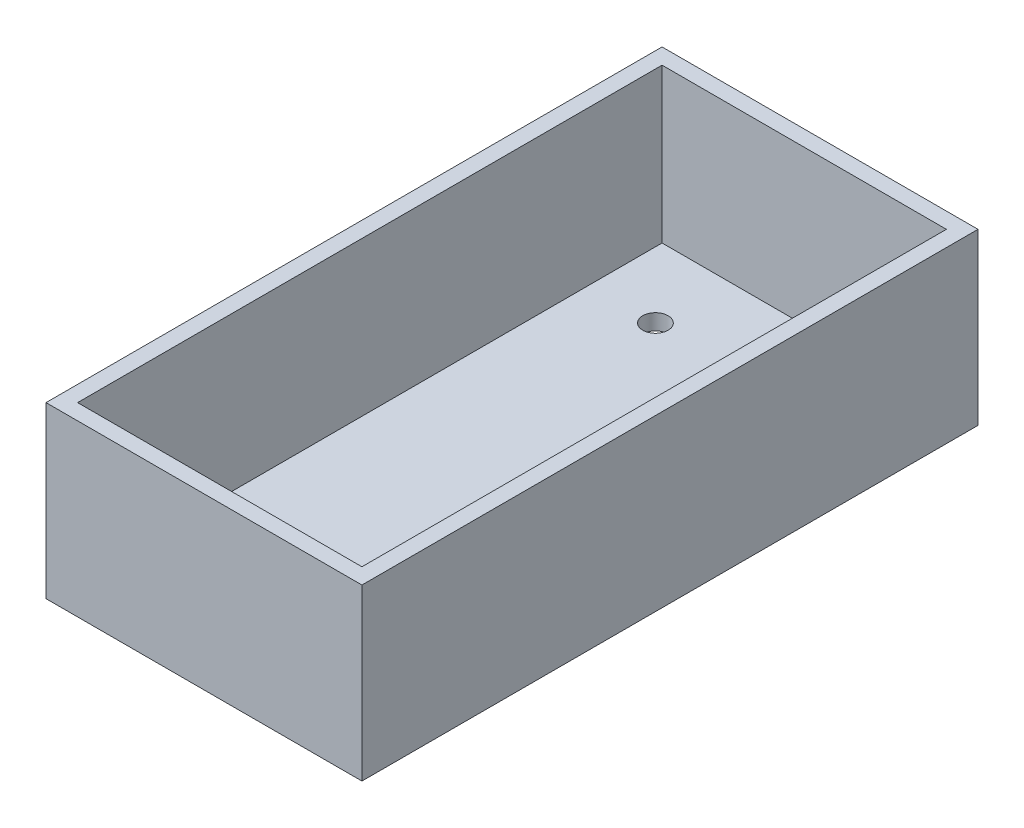
ISO-10303-21;
HEADER;
FILE_DESCRIPTION(('STEP AP214'),'2;1');
FILE_NAME('part.step','',(''),(''),'','','');
FILE_SCHEMA(('AUTOMOTIVE_DESIGN { 1 0 10303 214 1 1 1 1 }'));
ENDSEC;
DATA;
#1=APPLICATION_CONTEXT('core data for automotive mechanical design processes');
#2=APPLICATION_PROTOCOL_DEFINITION('international standard','automotive_design',2000,#1);
#3=PRODUCT_CONTEXT('',#1,'mechanical');
#4=PRODUCT('Part','Part','',(#3));
#5=PRODUCT_RELATED_PRODUCT_CATEGORY('part','',(#4));
#6=PRODUCT_DEFINITION_FORMATION('','',#4);
#7=PRODUCT_DEFINITION_CONTEXT('part definition',#1,'design');
#8=PRODUCT_DEFINITION('design','',#6,#7);
#9=PRODUCT_DEFINITION_SHAPE('','',#8);
#10=(LENGTH_UNIT() NAMED_UNIT(*) SI_UNIT(.MILLI.,.METRE.));
#11=(NAMED_UNIT(*) PLANE_ANGLE_UNIT() SI_UNIT($,.RADIAN.));
#12=(NAMED_UNIT(*) SI_UNIT($,.STERADIAN.) SOLID_ANGLE_UNIT());
#13=UNCERTAINTY_MEASURE_WITH_UNIT(LENGTH_MEASURE(1.E-05),#10,'distance_accuracy_value','');
#14=(GEOMETRIC_REPRESENTATION_CONTEXT(3) GLOBAL_UNCERTAINTY_ASSIGNED_CONTEXT((#13)) GLOBAL_UNIT_ASSIGNED_CONTEXT((#10,
#11,#12)) REPRESENTATION_CONTEXT('',''));
#15=CARTESIAN_POINT('',(0.,0.,0.));
#16=DIRECTION('',(0.,0.,1.));
#17=DIRECTION('',(1.,0.,0.));
#18=AXIS2_PLACEMENT_3D('',#15,#16,#17);
#19=CARTESIAN_POINT('',(0.,21.5,0.));
#20=DIRECTION('',(0.,-1.,0.));
#21=DIRECTION('',(0.,0.,-1.));
#22=AXIS2_PLACEMENT_3D('',#19,#20,#21);
#23=PLANE('',#22);
#24=DIRECTION('',(1.,0.,0.));
#25=VECTOR('',#24,1.);
#26=CARTESIAN_POINT('',(40.,21.5,0.));
#27=LINE('',#26,#25);
#28=CARTESIAN_POINT('',(0.,21.5,0.));
#29=VERTEX_POINT('',#28);
#30=CARTESIAN_POINT('',(40.,21.5,0.));
#31=VERTEX_POINT('',#30);
#32=EDGE_CURVE('E142',#29,#31,#27,.T.);
#33=ORIENTED_EDGE('',*,*,#32,.T.);
#34=DIRECTION('',(0.,0.,-1.));
#35=VECTOR('',#34,1.);
#36=CARTESIAN_POINT('',(40.,21.5,-78.));
#37=LINE('',#36,#35);
#38=CARTESIAN_POINT('',(40.,21.5,-78.));
#39=VERTEX_POINT('',#38);
#40=EDGE_CURVE('E86',#31,#39,#37,.T.);
#41=ORIENTED_EDGE('',*,*,#40,.T.);
#42=DIRECTION('',(-1.,0.,0.));
#43=VECTOR('',#42,1.);
#44=CARTESIAN_POINT('',(0.,21.5,-78.));
#45=LINE('',#44,#43);
#46=CARTESIAN_POINT('',(0.,21.5,-78.));
#47=VERTEX_POINT('',#46);
#48=EDGE_CURVE('E145',#39,#47,#45,.T.);
#49=ORIENTED_EDGE('',*,*,#48,.T.);
#50=DIRECTION('',(0.,0.,1.));
#51=VECTOR('',#50,1.);
#52=CARTESIAN_POINT('',(0.,21.5,0.));
#53=LINE('',#52,#51);
#54=EDGE_CURVE('E58',#47,#29,#53,.T.);
#55=ORIENTED_EDGE('',*,*,#54,.T.);
#56=EDGE_LOOP('',(#33,#41,#49,#55));
#57=FACE_BOUND('',#56,.T.);
#58=DIRECTION('',(1.,0.,0.));
#59=VECTOR('',#58,1.);
#60=CARTESIAN_POINT('',(0.,21.5,-2.));
#61=LINE('',#60,#59);
#62=CARTESIAN_POINT('',(2.,21.5,-2.));
#63=VERTEX_POINT('',#62);
#64=CARTESIAN_POINT('',(38.,21.5,-2.));
#65=VERTEX_POINT('',#64);
#66=EDGE_CURVE('E131',#63,#65,#61,.T.);
#67=ORIENTED_EDGE('',*,*,#66,.F.);
#68=DIRECTION('',(0.,0.,1.));
#69=VECTOR('',#68,1.);
#70=CARTESIAN_POINT('',(2.,21.5,0.));
#71=LINE('',#70,#69);
#72=CARTESIAN_POINT('',(2.,21.5,-76.));
#73=VERTEX_POINT('',#72);
#74=EDGE_CURVE('E140',#73,#63,#71,.T.);
#75=ORIENTED_EDGE('',*,*,#74,.F.);
#76=DIRECTION('',(-1.,0.,0.));
#77=VECTOR('',#76,1.);
#78=CARTESIAN_POINT('',(0.,21.5,-76.));
#79=LINE('',#78,#77);
#80=CARTESIAN_POINT('',(38.,21.5,-76.));
#81=VERTEX_POINT('',#80);
#82=EDGE_CURVE('E138',#81,#73,#79,.T.);
#83=ORIENTED_EDGE('',*,*,#82,.F.);
#84=DIRECTION('',(0.,0.,-1.));
#85=VECTOR('',#84,1.);
#86=CARTESIAN_POINT('',(38.,21.5,0.));
#87=LINE('',#86,#85);
#88=EDGE_CURVE('E123',#65,#81,#87,.T.);
#89=ORIENTED_EDGE('',*,*,#88,.F.);
#90=EDGE_LOOP('',(#67,#75,#83,#89));
#91=FACE_BOUND('',#90,.T.);
#92=ADVANCED_FACE('F32',(#57,#91),#23,.F.);
#93=CARTESIAN_POINT('',(40.,21.5,0.));
#94=DIRECTION('',(0.,0.,-1.));
#95=DIRECTION('',(-1.,0.,0.));
#96=AXIS2_PLACEMENT_3D('',#93,#94,#95);
#97=PLANE('',#96);
#98=DIRECTION('',(1.,0.,0.));
#99=VECTOR('',#98,1.);
#100=CARTESIAN_POINT('',(40.,0.,0.));
#101=LINE('',#100,#99);
#102=CARTESIAN_POINT('',(0.,0.,0.));
#103=VERTEX_POINT('',#102);
#104=CARTESIAN_POINT('',(40.,0.,0.));
#105=VERTEX_POINT('',#104);
#106=EDGE_CURVE('E149',#103,#105,#101,.T.);
#107=ORIENTED_EDGE('',*,*,#106,.T.);
#108=DIRECTION('',(0.,-1.,0.));
#109=VECTOR('',#108,1.);
#110=CARTESIAN_POINT('',(40.,21.5,0.));
#111=LINE('',#110,#109);
#112=EDGE_CURVE('E11',#31,#105,#111,.T.);
#113=ORIENTED_EDGE('',*,*,#112,.F.);
#114=ORIENTED_EDGE('',*,*,#32,.F.);
#115=DIRECTION('',(0.,-1.,0.));
#116=VECTOR('',#115,1.);
#117=CARTESIAN_POINT('',(0.,21.5,0.));
#118=LINE('',#117,#116);
#119=EDGE_CURVE('E148',#29,#103,#118,.T.);
#120=ORIENTED_EDGE('',*,*,#119,.T.);
#121=EDGE_LOOP('',(#107,#113,#114,#120));
#122=FACE_BOUND('',#121,.T.);
#123=ADVANCED_FACE('F34',(#122),#97,.F.);
#124=CARTESIAN_POINT('',(40.,21.5,-78.));
#125=DIRECTION('',(-1.,0.,0.));
#126=DIRECTION('',(0.,0.,1.));
#127=AXIS2_PLACEMENT_3D('',#124,#125,#126);
#128=PLANE('',#127);
#129=DIRECTION('',(0.,0.,-1.));
#130=VECTOR('',#129,1.);
#131=CARTESIAN_POINT('',(40.,0.,-78.));
#132=LINE('',#131,#130);
#133=CARTESIAN_POINT('',(40.,0.,-78.));
#134=VERTEX_POINT('',#133);
#135=EDGE_CURVE('E152',#105,#134,#132,.T.);
#136=ORIENTED_EDGE('',*,*,#135,.T.);
#137=DIRECTION('',(0.,-1.,0.));
#138=VECTOR('',#137,1.);
#139=CARTESIAN_POINT('',(40.,21.5,-78.));
#140=LINE('',#139,#138);
#141=EDGE_CURVE('E41',#39,#134,#140,.T.);
#142=ORIENTED_EDGE('',*,*,#141,.F.);
#143=ORIENTED_EDGE('',*,*,#40,.F.);
#144=ORIENTED_EDGE('',*,*,#112,.T.);
#145=EDGE_LOOP('',(#136,#142,#143,#144));
#146=FACE_BOUND('',#145,.T.);
#147=ADVANCED_FACE('F200',(#146),#128,.F.);
#148=CARTESIAN_POINT('',(0.,21.5,-78.));
#149=DIRECTION('',(0.,0.,1.));
#150=DIRECTION('',(1.,0.,0.));
#151=AXIS2_PLACEMENT_3D('',#148,#149,#150);
#152=PLANE('',#151);
#153=DIRECTION('',(-1.,0.,0.));
#154=VECTOR('',#153,1.);
#155=CARTESIAN_POINT('',(0.,0.,-78.));
#156=LINE('',#155,#154);
#157=CARTESIAN_POINT('',(0.,0.,-78.));
#158=VERTEX_POINT('',#157);
#159=EDGE_CURVE('E154',#134,#158,#156,.T.);
#160=ORIENTED_EDGE('',*,*,#159,.T.);
#161=DIRECTION('',(0.,-1.,0.));
#162=VECTOR('',#161,1.);
#163=CARTESIAN_POINT('',(0.,21.5,-78.));
#164=LINE('',#163,#162);
#165=EDGE_CURVE('E158',#47,#158,#164,.T.);
#166=ORIENTED_EDGE('',*,*,#165,.F.);
#167=ORIENTED_EDGE('',*,*,#48,.F.);
#168=ORIENTED_EDGE('',*,*,#141,.T.);
#169=EDGE_LOOP('',(#160,#166,#167,#168));
#170=FACE_BOUND('',#169,.T.);
#171=ADVANCED_FACE('F212',(#170),#152,.F.);
#172=CARTESIAN_POINT('',(0.,21.5,0.));
#173=DIRECTION('',(1.,0.,0.));
#174=DIRECTION('',(0.,0.,-1.));
#175=AXIS2_PLACEMENT_3D('',#172,#173,#174);
#176=PLANE('',#175);
#177=DIRECTION('',(0.,0.,1.));
#178=VECTOR('',#177,1.);
#179=CARTESIAN_POINT('',(0.,0.,0.));
#180=LINE('',#179,#178);
#181=EDGE_CURVE('E79',#158,#103,#180,.T.);
#182=ORIENTED_EDGE('',*,*,#181,.T.);
#183=ORIENTED_EDGE('',*,*,#119,.F.);
#184=ORIENTED_EDGE('',*,*,#54,.F.);
#185=ORIENTED_EDGE('',*,*,#165,.T.);
#186=EDGE_LOOP('',(#182,#183,#184,#185));
#187=FACE_BOUND('',#186,.T.);
#188=ADVANCED_FACE('F208',(#187),#176,.F.);
#189=CARTESIAN_POINT('',(0.,0.,0.));
#190=DIRECTION('',(0.,-1.,0.));
#191=DIRECTION('',(0.,0.,-1.));
#192=AXIS2_PLACEMENT_3D('',#189,#190,#191);
#193=PLANE('',#192);
#194=CARTESIAN_POINT('',(29.65,0.,-66.81));
#195=DIRECTION('',(0.,-1.,0.));
#196=DIRECTION('',(0.,0.,-1.));
#197=AXIS2_PLACEMENT_3D('',#194,#195,#196);
#198=CIRCLE('',#197,1.6);
#199=CARTESIAN_POINT('',(29.65,0.,-68.41));
#200=VERTEX_POINT('',#199);
#201=EDGE_CURVE('E182',#200,#200,#198,.T.);
#202=ORIENTED_EDGE('',*,*,#201,.F.);
#203=EDGE_LOOP('',(#202));
#204=FACE_BOUND('',#203,.T.);
#205=CARTESIAN_POINT('',(10.35,0.,-11.19));
#206=DIRECTION('',(0.,-1.,0.));
#207=DIRECTION('',(0.,0.,-1.));
#208=AXIS2_PLACEMENT_3D('',#205,#206,#207);
#209=CIRCLE('',#208,1.6);
#210=CARTESIAN_POINT('',(10.35,0.,-12.79));
#211=VERTEX_POINT('',#210);
#212=EDGE_CURVE('E171',#211,#211,#209,.T.);
#213=ORIENTED_EDGE('',*,*,#212,.F.);
#214=EDGE_LOOP('',(#213));
#215=FACE_BOUND('',#214,.T.);
#216=CARTESIAN_POINT('',(29.65,0.,-11.19));
#217=DIRECTION('',(0.,-1.,0.));
#218=DIRECTION('',(0.,0.,-1.));
#219=AXIS2_PLACEMENT_3D('',#216,#217,#218);
#220=CIRCLE('',#219,1.6);
#221=CARTESIAN_POINT('',(29.65,0.,-12.79));
#222=VERTEX_POINT('',#221);
#223=EDGE_CURVE('E168',#222,#222,#220,.T.);
#224=ORIENTED_EDGE('',*,*,#223,.F.);
#225=EDGE_LOOP('',(#224));
#226=FACE_BOUND('',#225,.T.);
#227=CARTESIAN_POINT('',(10.35,0.,-66.81));
#228=DIRECTION('',(0.,-1.,0.));
#229=DIRECTION('',(0.,0.,-1.));
#230=AXIS2_PLACEMENT_3D('',#227,#228,#229);
#231=CIRCLE('',#230,1.6);
#232=CARTESIAN_POINT('',(10.35,0.,-68.41));
#233=VERTEX_POINT('',#232);
#234=EDGE_CURVE('E165',#233,#233,#231,.T.);
#235=ORIENTED_EDGE('',*,*,#234,.F.);
#236=EDGE_LOOP('',(#235));
#237=FACE_BOUND('',#236,.T.);
#238=ORIENTED_EDGE('',*,*,#106,.F.);
#239=ORIENTED_EDGE('',*,*,#181,.F.);
#240=ORIENTED_EDGE('',*,*,#159,.F.);
#241=ORIENTED_EDGE('',*,*,#135,.F.);
#242=EDGE_LOOP('',(#238,#239,#240,#241));
#243=FACE_BOUND('',#242,.T.);
#244=ADVANCED_FACE('F205',(#204,#215,#226,#237,#243),#193,.T.);
#245=CARTESIAN_POINT('',(40.,21.5,-2.));
#246=DIRECTION('',(0.,0.,-1.));
#247=DIRECTION('',(-1.,0.,0.));
#248=AXIS2_PLACEMENT_3D('',#245,#246,#247);
#249=PLANE('',#248);
#250=DIRECTION('',(1.,0.,0.));
#251=VECTOR('',#250,1.);
#252=CARTESIAN_POINT('',(0.,2.,-2.));
#253=LINE('',#252,#251);
#254=CARTESIAN_POINT('',(2.,2.,-2.));
#255=VERTEX_POINT('',#254);
#256=CARTESIAN_POINT('',(38.,2.,-2.));
#257=VERTEX_POINT('',#256);
#258=EDGE_CURVE('E114',#255,#257,#253,.T.);
#259=ORIENTED_EDGE('',*,*,#258,.F.);
#260=DIRECTION('',(0.,-1.,0.));
#261=VECTOR('',#260,1.);
#262=CARTESIAN_POINT('',(2.,21.5,-2.));
#263=LINE('',#262,#261);
#264=EDGE_CURVE('E134',#63,#255,#263,.T.);
#265=ORIENTED_EDGE('',*,*,#264,.F.);
#266=ORIENTED_EDGE('',*,*,#66,.T.);
#267=DIRECTION('',(0.,-1.,0.));
#268=VECTOR('',#267,1.);
#269=CARTESIAN_POINT('',(38.,21.5,-2.));
#270=LINE('',#269,#268);
#271=EDGE_CURVE('E126',#65,#257,#270,.T.);
#272=ORIENTED_EDGE('',*,*,#271,.T.);
#273=EDGE_LOOP('',(#259,#265,#266,#272));
#274=FACE_BOUND('',#273,.T.);
#275=ADVANCED_FACE('F193',(#274),#249,.T.);
#276=CARTESIAN_POINT('',(38.,21.5,-78.));
#277=DIRECTION('',(-1.,0.,0.));
#278=DIRECTION('',(0.,0.,1.));
#279=AXIS2_PLACEMENT_3D('',#276,#277,#278);
#280=PLANE('',#279);
#281=DIRECTION('',(0.,0.,-1.));
#282=VECTOR('',#281,1.);
#283=CARTESIAN_POINT('',(38.,2.,0.));
#284=LINE('',#283,#282);
#285=CARTESIAN_POINT('',(38.,2.,-76.));
#286=VERTEX_POINT('',#285);
#287=EDGE_CURVE('E108',#257,#286,#284,.T.);
#288=ORIENTED_EDGE('',*,*,#287,.F.);
#289=ORIENTED_EDGE('',*,*,#271,.F.);
#290=ORIENTED_EDGE('',*,*,#88,.T.);
#291=DIRECTION('',(0.,-1.,0.));
#292=VECTOR('',#291,1.);
#293=CARTESIAN_POINT('',(38.,21.5,-76.));
#294=LINE('',#293,#292);
#295=EDGE_CURVE('E120',#81,#286,#294,.T.);
#296=ORIENTED_EDGE('',*,*,#295,.T.);
#297=EDGE_LOOP('',(#288,#289,#290,#296));
#298=FACE_BOUND('',#297,.T.);
#299=ADVANCED_FACE('F121',(#298),#280,.T.);
#300=CARTESIAN_POINT('',(0.,21.5,-76.));
#301=DIRECTION('',(0.,0.,1.));
#302=DIRECTION('',(1.,0.,0.));
#303=AXIS2_PLACEMENT_3D('',#300,#301,#302);
#304=PLANE('',#303);
#305=DIRECTION('',(-1.,0.,0.));
#306=VECTOR('',#305,1.);
#307=CARTESIAN_POINT('',(0.,2.,-76.));
#308=LINE('',#307,#306);
#309=CARTESIAN_POINT('',(2.,2.,-76.));
#310=VERTEX_POINT('',#309);
#311=EDGE_CURVE('E112',#286,#310,#308,.T.);
#312=ORIENTED_EDGE('',*,*,#311,.F.);
#313=ORIENTED_EDGE('',*,*,#295,.F.);
#314=ORIENTED_EDGE('',*,*,#82,.T.);
#315=DIRECTION('',(0.,-1.,0.));
#316=VECTOR('',#315,1.);
#317=CARTESIAN_POINT('',(2.,21.5,-76.));
#318=LINE('',#317,#316);
#319=EDGE_CURVE('E49',#73,#310,#318,.T.);
#320=ORIENTED_EDGE('',*,*,#319,.T.);
#321=EDGE_LOOP('',(#312,#313,#314,#320));
#322=FACE_BOUND('',#321,.T.);
#323=ADVANCED_FACE('F128',(#322),#304,.T.);
#324=CARTESIAN_POINT('',(2.,21.5,0.));
#325=DIRECTION('',(1.,0.,0.));
#326=DIRECTION('',(0.,0.,-1.));
#327=AXIS2_PLACEMENT_3D('',#324,#325,#326);
#328=PLANE('',#327);
#329=DIRECTION('',(0.,0.,1.));
#330=VECTOR('',#329,1.);
#331=CARTESIAN_POINT('',(2.,2.,0.));
#332=LINE('',#331,#330);
#333=EDGE_CURVE('E129',#310,#255,#332,.T.);
#334=ORIENTED_EDGE('',*,*,#333,.F.);
#335=ORIENTED_EDGE('',*,*,#319,.F.);
#336=ORIENTED_EDGE('',*,*,#74,.T.);
#337=ORIENTED_EDGE('',*,*,#264,.T.);
#338=EDGE_LOOP('',(#334,#335,#336,#337));
#339=FACE_BOUND('',#338,.T.);
#340=ADVANCED_FACE('F189',(#339),#328,.T.);
#341=CARTESIAN_POINT('',(0.,2.,0.));
#342=DIRECTION('',(0.,-1.,0.));
#343=DIRECTION('',(0.,0.,-1.));
#344=AXIS2_PLACEMENT_3D('',#341,#342,#343);
#345=PLANE('',#344);
#346=CARTESIAN_POINT('',(29.65,2.,-66.81));
#347=DIRECTION('',(0.,-1.,0.));
#348=DIRECTION('',(0.,0.,-1.));
#349=AXIS2_PLACEMENT_3D('',#346,#347,#348);
#350=CIRCLE('',#349,1.6);
#351=CARTESIAN_POINT('',(29.65,2.,-68.41));
#352=VERTEX_POINT('',#351);
#353=EDGE_CURVE('E36',#352,#352,#350,.T.);
#354=ORIENTED_EDGE('',*,*,#353,.T.);
#355=EDGE_LOOP('',(#354));
#356=FACE_BOUND('',#355,.T.);
#357=CARTESIAN_POINT('',(10.35,2.,-11.19));
#358=DIRECTION('',(0.,-1.,0.));
#359=DIRECTION('',(0.,0.,-1.));
#360=AXIS2_PLACEMENT_3D('',#357,#358,#359);
#361=CIRCLE('',#360,1.6);
#362=CARTESIAN_POINT('',(10.35,2.,-12.79));
#363=VERTEX_POINT('',#362);
#364=EDGE_CURVE('E169',#363,#363,#361,.T.);
#365=ORIENTED_EDGE('',*,*,#364,.T.);
#366=EDGE_LOOP('',(#365));
#367=FACE_BOUND('',#366,.T.);
#368=CARTESIAN_POINT('',(29.65,2.,-11.19));
#369=DIRECTION('',(0.,-1.,0.));
#370=DIRECTION('',(0.,0.,-1.));
#371=AXIS2_PLACEMENT_3D('',#368,#369,#370);
#372=CIRCLE('',#371,1.6);
#373=CARTESIAN_POINT('',(29.65,2.,-12.79));
#374=VERTEX_POINT('',#373);
#375=EDGE_CURVE('E166',#374,#374,#372,.T.);
#376=ORIENTED_EDGE('',*,*,#375,.T.);
#377=EDGE_LOOP('',(#376));
#378=FACE_BOUND('',#377,.T.);
#379=CARTESIAN_POINT('',(10.35,2.,-66.81));
#380=DIRECTION('',(0.,-1.,0.));
#381=DIRECTION('',(0.,0.,-1.));
#382=AXIS2_PLACEMENT_3D('',#379,#380,#381);
#383=CIRCLE('',#382,1.6);
#384=CARTESIAN_POINT('',(10.35,2.,-68.41));
#385=VERTEX_POINT('',#384);
#386=EDGE_CURVE('E162',#385,#385,#383,.T.);
#387=ORIENTED_EDGE('',*,*,#386,.T.);
#388=EDGE_LOOP('',(#387));
#389=FACE_BOUND('',#388,.T.);
#390=ORIENTED_EDGE('',*,*,#258,.T.);
#391=ORIENTED_EDGE('',*,*,#287,.T.);
#392=ORIENTED_EDGE('',*,*,#311,.T.);
#393=ORIENTED_EDGE('',*,*,#333,.T.);
#394=EDGE_LOOP('',(#390,#391,#392,#393));
#395=FACE_BOUND('',#394,.T.);
#396=ADVANCED_FACE('F110',(#356,#367,#378,#389,#395),#345,.F.);
#397=CARTESIAN_POINT('',(10.35,-18.5,-66.81));
#398=DIRECTION('',(0.,1.,0.));
#399=DIRECTION('',(0.,0.,1.));
#400=AXIS2_PLACEMENT_3D('',#397,#398,#399);
#401=CYLINDRICAL_SURFACE('',#400,1.6);
#402=ORIENTED_EDGE('',*,*,#234,.T.);
#403=EDGE_LOOP('',(#402));
#404=FACE_BOUND('',#403,.T.);
#405=ORIENTED_EDGE('',*,*,#386,.F.);
#406=EDGE_LOOP('',(#405));
#407=FACE_BOUND('',#406,.T.);
#408=ADVANCED_FACE('F268',(#404,#407),#401,.F.);
#409=CARTESIAN_POINT('',(29.65,-18.5,-11.19));
#410=DIRECTION('',(0.,1.,0.));
#411=DIRECTION('',(0.,0.,1.));
#412=AXIS2_PLACEMENT_3D('',#409,#410,#411);
#413=CYLINDRICAL_SURFACE('',#412,1.6);
#414=ORIENTED_EDGE('',*,*,#223,.T.);
#415=EDGE_LOOP('',(#414));
#416=FACE_BOUND('',#415,.T.);
#417=ORIENTED_EDGE('',*,*,#375,.F.);
#418=EDGE_LOOP('',(#417));
#419=FACE_BOUND('',#418,.T.);
#420=ADVANCED_FACE('F275',(#416,#419),#413,.F.);
#421=CARTESIAN_POINT('',(10.35,-18.5,-11.19));
#422=DIRECTION('',(0.,1.,0.));
#423=DIRECTION('',(0.,0.,1.));
#424=AXIS2_PLACEMENT_3D('',#421,#422,#423);
#425=CYLINDRICAL_SURFACE('',#424,1.6);
#426=ORIENTED_EDGE('',*,*,#212,.T.);
#427=EDGE_LOOP('',(#426));
#428=FACE_BOUND('',#427,.T.);
#429=ORIENTED_EDGE('',*,*,#364,.F.);
#430=EDGE_LOOP('',(#429));
#431=FACE_BOUND('',#430,.T.);
#432=ADVANCED_FACE('F283',(#428,#431),#425,.F.);
#433=CARTESIAN_POINT('',(29.65,-18.5,-66.81));
#434=DIRECTION('',(0.,1.,0.));
#435=DIRECTION('',(0.,0.,1.));
#436=AXIS2_PLACEMENT_3D('',#433,#434,#435);
#437=CYLINDRICAL_SURFACE('',#436,1.6);
#438=ORIENTED_EDGE('',*,*,#201,.T.);
#439=EDGE_LOOP('',(#438));
#440=FACE_BOUND('',#439,.T.);
#441=ORIENTED_EDGE('',*,*,#353,.F.);
#442=EDGE_LOOP('',(#441));
#443=FACE_BOUND('',#442,.T.);
#444=ADVANCED_FACE('F290',(#440,#443),#437,.F.);
#445=CLOSED_SHELL('',(#92,#123,#147,#171,#188,#244,#275,#299,#323,#340,#396,#408,#420,#432,#444));
#446=MANIFOLD_SOLID_BREP('B2',#445);
#447=ADVANCED_BREP_SHAPE_REPRESENTATION('',(#18,#446),#14);
#448=SHAPE_DEFINITION_REPRESENTATION(#9,#447);
ENDSEC;
END-ISO-10303-21;
